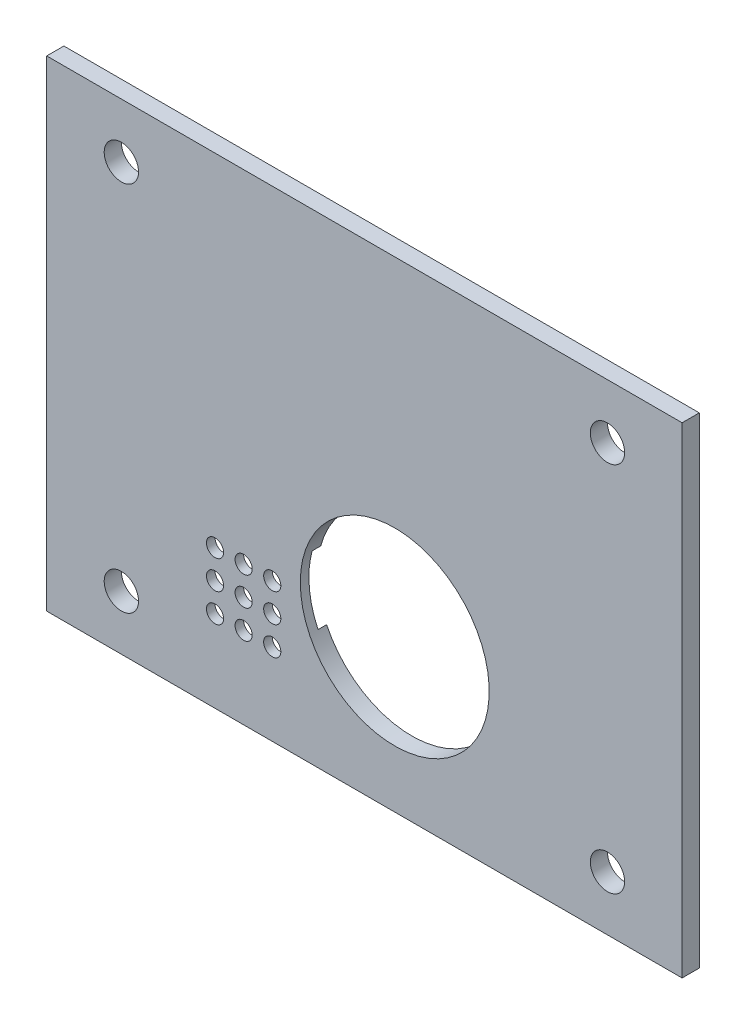
ISO-10303-21;
HEADER;
FILE_DESCRIPTION(('STEP AP214'),'2;1');
FILE_NAME('part.step','',(''),(''),'','','');
FILE_SCHEMA(('AUTOMOTIVE_DESIGN { 1 0 10303 214 1 1 1 1 }'));
ENDSEC;
DATA;
#1=APPLICATION_CONTEXT('core data for automotive mechanical design processes');
#2=APPLICATION_PROTOCOL_DEFINITION('international standard','automotive_design',2000,#1);
#3=PRODUCT_CONTEXT('',#1,'mechanical');
#4=PRODUCT('Part','Part','',(#3));
#5=PRODUCT_RELATED_PRODUCT_CATEGORY('part','',(#4));
#6=PRODUCT_DEFINITION_FORMATION('','',#4);
#7=PRODUCT_DEFINITION_CONTEXT('part definition',#1,'design');
#8=PRODUCT_DEFINITION('design','',#6,#7);
#9=PRODUCT_DEFINITION_SHAPE('','',#8);
#10=(LENGTH_UNIT() NAMED_UNIT(*) SI_UNIT(.MILLI.,.METRE.));
#11=(NAMED_UNIT(*) PLANE_ANGLE_UNIT() SI_UNIT($,.RADIAN.));
#12=(NAMED_UNIT(*) SI_UNIT($,.STERADIAN.) SOLID_ANGLE_UNIT());
#13=UNCERTAINTY_MEASURE_WITH_UNIT(LENGTH_MEASURE(1.E-05),#10,'distance_accuracy_value','');
#14=(GEOMETRIC_REPRESENTATION_CONTEXT(3) GLOBAL_UNCERTAINTY_ASSIGNED_CONTEXT((#13)) GLOBAL_UNIT_ASSIGNED_CONTEXT((#10,
#11,#12)) REPRESENTATION_CONTEXT('',''));
#15=CARTESIAN_POINT('',(0.,0.,0.));
#16=DIRECTION('',(0.,0.,1.));
#17=DIRECTION('',(1.,0.,0.));
#18=AXIS2_PLACEMENT_3D('',#15,#16,#17);
#19=CARTESIAN_POINT('',(0.,0.,0.));
#20=DIRECTION('',(0.,0.,-1.));
#21=DIRECTION('',(-1.,0.,0.));
#22=AXIS2_PLACEMENT_3D('',#19,#20,#21);
#23=PLANE('',#22);
#24=CARTESIAN_POINT('',(95.96,7.54,0.));
#25=DIRECTION('',(0.,0.,1.));
#26=DIRECTION('',(1.,0.,0.));
#27=AXIS2_PLACEMENT_3D('',#24,#25,#26);
#28=CIRCLE('',#27,3.00000000000001);
#29=CARTESIAN_POINT('',(98.96,7.54,0.));
#30=VERTEX_POINT('',#29);
#31=EDGE_CURVE('E158',#30,#30,#28,.T.);
#32=ORIENTED_EDGE('',*,*,#31,.T.);
#33=EDGE_LOOP('',(#32));
#34=FACE_BOUND('',#33,.T.);
#35=CARTESIAN_POINT('',(11.04,72.46,0.));
#36=DIRECTION('',(0.,0.,1.));
#37=DIRECTION('',(1.,0.,0.));
#38=AXIS2_PLACEMENT_3D('',#35,#36,#37);
#39=CIRCLE('',#38,3.);
#40=CARTESIAN_POINT('',(14.04,72.46,0.));
#41=VERTEX_POINT('',#40);
#42=EDGE_CURVE('E157',#41,#41,#39,.T.);
#43=ORIENTED_EDGE('',*,*,#42,.T.);
#44=EDGE_LOOP('',(#43));
#45=FACE_BOUND('',#44,.T.);
#46=CARTESIAN_POINT('',(95.96,72.46,0.));
#47=DIRECTION('',(0.,0.,1.));
#48=DIRECTION('',(1.,0.,0.));
#49=AXIS2_PLACEMENT_3D('',#46,#47,#48);
#50=CIRCLE('',#49,3.00000000000001);
#51=CARTESIAN_POINT('',(98.96,72.46,0.));
#52=VERTEX_POINT('',#51);
#53=EDGE_CURVE('E154',#52,#52,#50,.T.);
#54=ORIENTED_EDGE('',*,*,#53,.T.);
#55=EDGE_LOOP('',(#54));
#56=FACE_BOUND('',#55,.T.);
#57=CARTESIAN_POINT('',(11.04,7.54,0.));
#58=DIRECTION('',(0.,0.,1.));
#59=DIRECTION('',(1.,0.,0.));
#60=AXIS2_PLACEMENT_3D('',#57,#58,#59);
#61=CIRCLE('',#60,3.);
#62=CARTESIAN_POINT('',(14.04,7.54,0.));
#63=VERTEX_POINT('',#62);
#64=EDGE_CURVE('E161',#63,#63,#61,.T.);
#65=ORIENTED_EDGE('',*,*,#64,.T.);
#66=EDGE_LOOP('',(#65));
#67=FACE_BOUND('',#66,.T.);
#68=DIRECTION('',(0.,-1.,0.));
#69=VECTOR('',#68,1.);
#70=CARTESIAN_POINT('',(-2.,-2.,0.));
#71=LINE('',#70,#69);
#72=CARTESIAN_POINT('',(-2.,82.,0.));
#73=VERTEX_POINT('',#72);
#74=CARTESIAN_POINT('',(-2.,-2.,0.));
#75=VERTEX_POINT('',#74);
#76=EDGE_CURVE('E178',#73,#75,#71,.T.);
#77=ORIENTED_EDGE('',*,*,#76,.F.);
#78=DIRECTION('',(-1.,0.,0.));
#79=VECTOR('',#78,1.);
#80=CARTESIAN_POINT('',(-2.,82.,0.));
#81=LINE('',#80,#79);
#82=CARTESIAN_POINT('',(109.,82.,0.));
#83=VERTEX_POINT('',#82);
#84=EDGE_CURVE('E86',#83,#73,#81,.T.);
#85=ORIENTED_EDGE('',*,*,#84,.F.);
#86=DIRECTION('',(0.,1.,0.));
#87=VECTOR('',#86,1.);
#88=CARTESIAN_POINT('',(109.,-2.,0.));
#89=LINE('',#88,#87);
#90=CARTESIAN_POINT('',(109.,-2.,0.));
#91=VERTEX_POINT('',#90);
#92=EDGE_CURVE('E190',#91,#83,#89,.T.);
#93=ORIENTED_EDGE('',*,*,#92,.F.);
#94=DIRECTION('',(1.,0.,0.));
#95=VECTOR('',#94,1.);
#96=CARTESIAN_POINT('',(-2.,-2.,0.));
#97=LINE('',#96,#95);
#98=EDGE_CURVE('E188',#75,#91,#97,.T.);
#99=ORIENTED_EDGE('',*,*,#98,.F.);
#100=EDGE_LOOP('',(#77,#85,#93,#99));
#101=FACE_BOUND('',#100,.T.);
#102=DIRECTION('',(1.,0.,0.));
#103=VECTOR('',#102,1.);
#104=CARTESIAN_POINT('',(20.9,5.8,0.));
#105=LINE('',#104,#103);
#106=CARTESIAN_POINT('',(20.9,5.8,0.));
#107=VERTEX_POINT('',#106);
#108=CARTESIAN_POINT('',(43.9,5.8,0.));
#109=VERTEX_POINT('',#108);
#110=EDGE_CURVE('E142',#107,#109,#105,.T.);
#111=ORIENTED_EDGE('',*,*,#110,.T.);
#112=DIRECTION('',(0.,1.,0.));
#113=VECTOR('',#112,1.);
#114=CARTESIAN_POINT('',(43.9,5.8,0.));
#115=LINE('',#114,#113);
#116=CARTESIAN_POINT('',(43.9,17.4119819413322,0.));
#117=VERTEX_POINT('',#116);
#118=EDGE_CURVE('E255',#109,#117,#115,.T.);
#119=ORIENTED_EDGE('',*,*,#118,.T.);
#120=CARTESIAN_POINT('',(58.8,24.5,0.));
#121=DIRECTION('',(0.,0.,1.));
#122=DIRECTION('',(1.,0.,0.));
#123=AXIS2_PLACEMENT_3D('',#120,#121,#122);
#124=CIRCLE('',#123,16.5);
#125=CARTESIAN_POINT('',(42.8701537986081,28.8,0.));
#126=VERTEX_POINT('',#125);
#127=EDGE_CURVE('E143',#117,#126,#124,.T.);
#128=ORIENTED_EDGE('',*,*,#127,.T.);
#129=DIRECTION('',(-1.,0.,0.));
#130=VECTOR('',#129,1.);
#131=CARTESIAN_POINT('',(20.9,28.8,0.));
#132=LINE('',#131,#130);
#133=CARTESIAN_POINT('',(20.9,28.8,0.));
#134=VERTEX_POINT('',#133);
#135=EDGE_CURVE('E138',#126,#134,#132,.T.);
#136=ORIENTED_EDGE('',*,*,#135,.T.);
#137=DIRECTION('',(0.,-1.,0.));
#138=VECTOR('',#137,1.);
#139=CARTESIAN_POINT('',(20.9,5.8,0.));
#140=LINE('',#139,#138);
#141=EDGE_CURVE('E249',#134,#107,#140,.T.);
#142=ORIENTED_EDGE('',*,*,#141,.T.);
#143=EDGE_LOOP('',(#111,#119,#128,#136,#142));
#144=FACE_BOUND('',#143,.T.);
#145=ADVANCED_FACE('F39',(#34,#45,#56,#67,#101,#144),#23,.T.);
#146=CARTESIAN_POINT('',(58.8,24.5,6.));
#147=DIRECTION('',(0.,0.,-1.));
#148=DIRECTION('',(-1.,0.,0.));
#149=AXIS2_PLACEMENT_3D('',#146,#147,#148);
#150=CYLINDRICAL_SURFACE('',#149,16.5);
#151=CARTESIAN_POINT('',(58.8,24.5,3.));
#152=DIRECTION('',(0.,0.,-1.));
#153=DIRECTION('',(-1.,0.,0.));
#154=AXIS2_PLACEMENT_3D('',#151,#152,#153);
#155=CIRCLE('',#154,16.5);
#156=CARTESIAN_POINT('',(42.3,24.5,3.));
#157=VERTEX_POINT('',#156);
#158=EDGE_CURVE('E147',#157,#157,#155,.F.);
#159=ORIENTED_EDGE('',*,*,#158,.T.);
#160=EDGE_LOOP('',(#159));
#161=FACE_BOUND('',#160,.T.);
#162=ORIENTED_EDGE('',*,*,#127,.F.);
#163=DIRECTION('',(0.,0.,-1.));
#164=VECTOR('',#163,1.);
#165=CARTESIAN_POINT('',(43.9,17.4119819413322,6.));
#166=LINE('',#165,#164);
#167=CARTESIAN_POINT('',(43.9,17.4119819413322,1.5));
#168=VERTEX_POINT('',#167);
#169=EDGE_CURVE('E11',#117,#168,#166,.F.);
#170=ORIENTED_EDGE('',*,*,#169,.T.);
#171=CARTESIAN_POINT('',(58.8,24.5,1.5));
#172=DIRECTION('',(0.,0.,-1.));
#173=DIRECTION('',(-1.,0.,0.));
#174=AXIS2_PLACEMENT_3D('',#171,#172,#173);
#175=CIRCLE('',#174,16.5);
#176=CARTESIAN_POINT('',(42.8701537986081,28.8,1.5));
#177=VERTEX_POINT('',#176);
#178=EDGE_CURVE('E201',#168,#177,#175,.T.);
#179=ORIENTED_EDGE('',*,*,#178,.T.);
#180=DIRECTION('',(0.,0.,-1.));
#181=VECTOR('',#180,1.);
#182=CARTESIAN_POINT('',(42.8701537986081,28.8,6.));
#183=LINE('',#182,#181);
#184=EDGE_CURVE('E48',#177,#126,#183,.T.);
#185=ORIENTED_EDGE('',*,*,#184,.T.);
#186=EDGE_LOOP('',(#162,#170,#179,#185));
#187=FACE_BOUND('',#186,.T.);
#188=ADVANCED_FACE('F265',(#161,#187),#150,.F.);
#189=CARTESIAN_POINT('',(-2.,-2.,3.));
#190=DIRECTION('',(1.,0.,0.));
#191=DIRECTION('',(0.,0.,-1.));
#192=AXIS2_PLACEMENT_3D('',#189,#190,#191);
#193=PLANE('',#192);
#194=ORIENTED_EDGE('',*,*,#76,.T.);
#195=DIRECTION('',(0.,0.,-1.));
#196=VECTOR('',#195,1.);
#197=CARTESIAN_POINT('',(-2.,-2.,3.));
#198=LINE('',#197,#196);
#199=CARTESIAN_POINT('',(-2.,-2.,3.));
#200=VERTEX_POINT('',#199);
#201=EDGE_CURVE('E199',#200,#75,#198,.T.);
#202=ORIENTED_EDGE('',*,*,#201,.F.);
#203=DIRECTION('',(0.,-1.,0.));
#204=VECTOR('',#203,1.);
#205=CARTESIAN_POINT('',(-2.,-2.,3.));
#206=LINE('',#205,#204);
#207=CARTESIAN_POINT('',(-2.,82.,3.));
#208=VERTEX_POINT('',#207);
#209=EDGE_CURVE('E179',#208,#200,#206,.T.);
#210=ORIENTED_EDGE('',*,*,#209,.F.);
#211=DIRECTION('',(0.,0.,-1.));
#212=VECTOR('',#211,1.);
#213=CARTESIAN_POINT('',(-2.,82.,3.));
#214=LINE('',#213,#212);
#215=EDGE_CURVE('E185',#208,#73,#214,.T.);
#216=ORIENTED_EDGE('',*,*,#215,.T.);
#217=EDGE_LOOP('',(#194,#202,#210,#216));
#218=FACE_BOUND('',#217,.T.);
#219=ADVANCED_FACE('F41',(#218),#193,.F.);
#220=CARTESIAN_POINT('',(-2.,-2.,3.));
#221=DIRECTION('',(0.,1.,0.));
#222=DIRECTION('',(0.,0.,1.));
#223=AXIS2_PLACEMENT_3D('',#220,#221,#222);
#224=PLANE('',#223);
#225=ORIENTED_EDGE('',*,*,#98,.T.);
#226=DIRECTION('',(0.,0.,-1.));
#227=VECTOR('',#226,1.);
#228=CARTESIAN_POINT('',(109.,-2.,3.));
#229=LINE('',#228,#227);
#230=CARTESIAN_POINT('',(109.,-2.,3.));
#231=VERTEX_POINT('',#230);
#232=EDGE_CURVE('E196',#231,#91,#229,.T.);
#233=ORIENTED_EDGE('',*,*,#232,.F.);
#234=DIRECTION('',(1.,0.,0.));
#235=VECTOR('',#234,1.);
#236=CARTESIAN_POINT('',(-2.,-2.,3.));
#237=LINE('',#236,#235);
#238=EDGE_CURVE('E94',#200,#231,#237,.T.);
#239=ORIENTED_EDGE('',*,*,#238,.F.);
#240=ORIENTED_EDGE('',*,*,#201,.T.);
#241=EDGE_LOOP('',(#225,#233,#239,#240));
#242=FACE_BOUND('',#241,.T.);
#243=ADVANCED_FACE('F295',(#242),#224,.F.);
#244=CARTESIAN_POINT('',(109.,-2.,3.));
#245=DIRECTION('',(-1.,0.,0.));
#246=DIRECTION('',(0.,0.,1.));
#247=AXIS2_PLACEMENT_3D('',#244,#245,#246);
#248=PLANE('',#247);
#249=ORIENTED_EDGE('',*,*,#92,.T.);
#250=DIRECTION('',(0.,0.,-1.));
#251=VECTOR('',#250,1.);
#252=CARTESIAN_POINT('',(109.,82.,3.));
#253=LINE('',#252,#251);
#254=CARTESIAN_POINT('',(109.,82.,3.));
#255=VERTEX_POINT('',#254);
#256=EDGE_CURVE('E194',#255,#83,#253,.T.);
#257=ORIENTED_EDGE('',*,*,#256,.F.);
#258=DIRECTION('',(0.,1.,0.));
#259=VECTOR('',#258,1.);
#260=CARTESIAN_POINT('',(109.,-2.,3.));
#261=LINE('',#260,#259);
#262=EDGE_CURVE('E182',#231,#255,#261,.T.);
#263=ORIENTED_EDGE('',*,*,#262,.F.);
#264=ORIENTED_EDGE('',*,*,#232,.T.);
#265=EDGE_LOOP('',(#249,#257,#263,#264));
#266=FACE_BOUND('',#265,.T.);
#267=ADVANCED_FACE('F293',(#266),#248,.F.);
#268=CARTESIAN_POINT('',(-2.,82.,3.));
#269=DIRECTION('',(0.,-1.,0.));
#270=DIRECTION('',(0.,0.,-1.));
#271=AXIS2_PLACEMENT_3D('',#268,#269,#270);
#272=PLANE('',#271);
#273=ORIENTED_EDGE('',*,*,#84,.T.);
#274=ORIENTED_EDGE('',*,*,#215,.F.);
#275=DIRECTION('',(-1.,0.,0.));
#276=VECTOR('',#275,1.);
#277=CARTESIAN_POINT('',(-2.,82.,3.));
#278=LINE('',#277,#276);
#279=EDGE_CURVE('E65',#255,#208,#278,.T.);
#280=ORIENTED_EDGE('',*,*,#279,.F.);
#281=ORIENTED_EDGE('',*,*,#256,.T.);
#282=EDGE_LOOP('',(#273,#274,#280,#281));
#283=FACE_BOUND('',#282,.T.);
#284=ADVANCED_FACE('F290',(#283),#272,.F.);
#285=CARTESIAN_POINT('',(0.,0.,3.));
#286=DIRECTION('',(0.,0.,-1.));
#287=DIRECTION('',(-1.,0.,0.));
#288=AXIS2_PLACEMENT_3D('',#285,#286,#287);
#289=PLANE('',#288);
#290=CARTESIAN_POINT('',(27.4,17.3,3.));
#291=DIRECTION('',(0.,0.,-1.));
#292=DIRECTION('',(-1.,0.,0.));
#293=AXIS2_PLACEMENT_3D('',#290,#291,#292);
#294=CIRCLE('',#293,1.5);
#295=CARTESIAN_POINT('',(25.9,17.3,3.));
#296=VERTEX_POINT('',#295);
#297=EDGE_CURVE('E247',#296,#296,#294,.F.);
#298=ORIENTED_EDGE('',*,*,#297,.F.);
#299=EDGE_LOOP('',(#298));
#300=FACE_BOUND('',#299,.T.);
#301=CARTESIAN_POINT('',(27.4,22.3,3.));
#302=DIRECTION('',(0.,0.,-1.));
#303=DIRECTION('',(-1.,0.,0.));
#304=AXIS2_PLACEMENT_3D('',#301,#302,#303);
#305=CIRCLE('',#304,1.5);
#306=CARTESIAN_POINT('',(25.9,22.3,3.));
#307=VERTEX_POINT('',#306);
#308=EDGE_CURVE('E235',#307,#307,#305,.F.);
#309=ORIENTED_EDGE('',*,*,#308,.F.);
#310=EDGE_LOOP('',(#309));
#311=FACE_BOUND('',#310,.T.);
#312=CARTESIAN_POINT('',(32.4,12.3,3.));
#313=DIRECTION('',(0.,0.,-1.));
#314=DIRECTION('',(-1.,0.,0.));
#315=AXIS2_PLACEMENT_3D('',#312,#313,#314);
#316=CIRCLE('',#315,1.5);
#317=CARTESIAN_POINT('',(30.9,12.3,3.));
#318=VERTEX_POINT('',#317);
#319=EDGE_CURVE('E232',#318,#318,#316,.F.);
#320=ORIENTED_EDGE('',*,*,#319,.F.);
#321=EDGE_LOOP('',(#320));
#322=FACE_BOUND('',#321,.T.);
#323=CARTESIAN_POINT('',(32.4,17.3,3.));
#324=DIRECTION('',(0.,0.,-1.));
#325=DIRECTION('',(-1.,0.,0.));
#326=AXIS2_PLACEMENT_3D('',#323,#324,#325);
#327=CIRCLE('',#326,1.5);
#328=CARTESIAN_POINT('',(30.9,17.3,3.));
#329=VERTEX_POINT('',#328);
#330=EDGE_CURVE('E229',#329,#329,#327,.F.);
#331=ORIENTED_EDGE('',*,*,#330,.F.);
#332=EDGE_LOOP('',(#331));
#333=FACE_BOUND('',#332,.T.);
#334=CARTESIAN_POINT('',(37.4,22.3,3.));
#335=DIRECTION('',(0.,0.,-1.));
#336=DIRECTION('',(-1.,0.,0.));
#337=AXIS2_PLACEMENT_3D('',#334,#335,#336);
#338=CIRCLE('',#337,1.5);
#339=CARTESIAN_POINT('',(35.9,22.3,3.));
#340=VERTEX_POINT('',#339);
#341=EDGE_CURVE('E225',#340,#340,#338,.F.);
#342=ORIENTED_EDGE('',*,*,#341,.F.);
#343=EDGE_LOOP('',(#342));
#344=FACE_BOUND('',#343,.T.);
#345=CARTESIAN_POINT('',(37.4,17.3,3.));
#346=DIRECTION('',(0.,0.,-1.));
#347=DIRECTION('',(-1.,0.,0.));
#348=AXIS2_PLACEMENT_3D('',#345,#346,#347);
#349=CIRCLE('',#348,1.5);
#350=CARTESIAN_POINT('',(35.9,17.3,3.));
#351=VERTEX_POINT('',#350);
#352=EDGE_CURVE('E221',#351,#351,#349,.F.);
#353=ORIENTED_EDGE('',*,*,#352,.F.);
#354=EDGE_LOOP('',(#353));
#355=FACE_BOUND('',#354,.T.);
#356=CARTESIAN_POINT('',(37.4,12.3,3.));
#357=DIRECTION('',(0.,0.,-1.));
#358=DIRECTION('',(-1.,0.,0.));
#359=AXIS2_PLACEMENT_3D('',#356,#357,#358);
#360=CIRCLE('',#359,1.5);
#361=CARTESIAN_POINT('',(35.9,12.3,3.));
#362=VERTEX_POINT('',#361);
#363=EDGE_CURVE('E217',#362,#362,#360,.F.);
#364=ORIENTED_EDGE('',*,*,#363,.F.);
#365=EDGE_LOOP('',(#364));
#366=FACE_BOUND('',#365,.T.);
#367=CARTESIAN_POINT('',(32.4,22.3,3.));
#368=DIRECTION('',(0.,0.,-1.));
#369=DIRECTION('',(-1.,0.,0.));
#370=AXIS2_PLACEMENT_3D('',#367,#368,#369);
#371=CIRCLE('',#370,1.5);
#372=CARTESIAN_POINT('',(30.9,22.3,3.));
#373=VERTEX_POINT('',#372);
#374=EDGE_CURVE('E213',#373,#373,#371,.F.);
#375=ORIENTED_EDGE('',*,*,#374,.F.);
#376=EDGE_LOOP('',(#375));
#377=FACE_BOUND('',#376,.T.);
#378=CARTESIAN_POINT('',(27.4,12.3,3.));
#379=DIRECTION('',(0.,0.,-1.));
#380=DIRECTION('',(-1.,0.,0.));
#381=AXIS2_PLACEMENT_3D('',#378,#379,#380);
#382=CIRCLE('',#381,1.5);
#383=CARTESIAN_POINT('',(25.9,12.3,3.));
#384=VERTEX_POINT('',#383);
#385=EDGE_CURVE('E209',#384,#384,#382,.F.);
#386=ORIENTED_EDGE('',*,*,#385,.F.);
#387=EDGE_LOOP('',(#386));
#388=FACE_BOUND('',#387,.T.);
#389=ORIENTED_EDGE('',*,*,#158,.F.);
#390=EDGE_LOOP('',(#389));
#391=FACE_BOUND('',#390,.T.);
#392=CARTESIAN_POINT('',(95.96,7.54,3.));
#393=DIRECTION('',(0.,0.,-1.));
#394=DIRECTION('',(-1.,0.,0.));
#395=AXIS2_PLACEMENT_3D('',#392,#393,#394);
#396=CIRCLE('',#395,3.00000000000001);
#397=CARTESIAN_POINT('',(92.96,7.54,3.));
#398=VERTEX_POINT('',#397);
#399=EDGE_CURVE('E175',#398,#398,#396,.F.);
#400=ORIENTED_EDGE('',*,*,#399,.F.);
#401=EDGE_LOOP('',(#400));
#402=FACE_BOUND('',#401,.T.);
#403=CARTESIAN_POINT('',(11.04,72.46,3.));
#404=DIRECTION('',(0.,0.,-1.));
#405=DIRECTION('',(-1.,0.,0.));
#406=AXIS2_PLACEMENT_3D('',#403,#404,#405);
#407=CIRCLE('',#406,3.);
#408=CARTESIAN_POINT('',(8.04,72.46,3.));
#409=VERTEX_POINT('',#408);
#410=EDGE_CURVE('E172',#409,#409,#407,.F.);
#411=ORIENTED_EDGE('',*,*,#410,.F.);
#412=EDGE_LOOP('',(#411));
#413=FACE_BOUND('',#412,.T.);
#414=CARTESIAN_POINT('',(95.96,72.46,3.));
#415=DIRECTION('',(0.,0.,-1.));
#416=DIRECTION('',(-1.,0.,0.));
#417=AXIS2_PLACEMENT_3D('',#414,#415,#416);
#418=CIRCLE('',#417,3.00000000000001);
#419=CARTESIAN_POINT('',(92.96,72.46,3.));
#420=VERTEX_POINT('',#419);
#421=EDGE_CURVE('E169',#420,#420,#418,.F.);
#422=ORIENTED_EDGE('',*,*,#421,.F.);
#423=EDGE_LOOP('',(#422));
#424=FACE_BOUND('',#423,.T.);
#425=CARTESIAN_POINT('',(11.04,7.54,3.));
#426=DIRECTION('',(0.,0.,-1.));
#427=DIRECTION('',(-1.,0.,0.));
#428=AXIS2_PLACEMENT_3D('',#425,#426,#427);
#429=CIRCLE('',#428,3.);
#430=CARTESIAN_POINT('',(8.04,7.54,3.));
#431=VERTEX_POINT('',#430);
#432=EDGE_CURVE('E166',#431,#431,#429,.F.);
#433=ORIENTED_EDGE('',*,*,#432,.F.);
#434=EDGE_LOOP('',(#433));
#435=FACE_BOUND('',#434,.T.);
#436=ORIENTED_EDGE('',*,*,#209,.T.);
#437=ORIENTED_EDGE('',*,*,#238,.T.);
#438=ORIENTED_EDGE('',*,*,#262,.T.);
#439=ORIENTED_EDGE('',*,*,#279,.T.);
#440=EDGE_LOOP('',(#436,#437,#438,#439));
#441=FACE_BOUND('',#440,.T.);
#442=ADVANCED_FACE('F288',(#300,#311,#322,#333,#344,#355,#366,#377,#388,#391,#402,#413,#424,
#435,#441),#289,.F.);
#443=CARTESIAN_POINT('',(11.04,7.54,6.));
#444=DIRECTION('',(0.,0.,-1.));
#445=DIRECTION('',(-1.,0.,0.));
#446=AXIS2_PLACEMENT_3D('',#443,#444,#445);
#447=CYLINDRICAL_SURFACE('',#446,3.);
#448=ORIENTED_EDGE('',*,*,#64,.F.);
#449=EDGE_LOOP('',(#448));
#450=FACE_BOUND('',#449,.T.);
#451=ORIENTED_EDGE('',*,*,#432,.T.);
#452=EDGE_LOOP('',(#451));
#453=FACE_BOUND('',#452,.T.);
#454=ADVANCED_FACE('F310',(#450,#453),#447,.F.);
#455=CARTESIAN_POINT('',(95.96,72.46,6.));
#456=DIRECTION('',(0.,0.,-1.));
#457=DIRECTION('',(-1.,0.,0.));
#458=AXIS2_PLACEMENT_3D('',#455,#456,#457);
#459=CYLINDRICAL_SURFACE('',#458,3.00000000000001);
#460=ORIENTED_EDGE('',*,*,#53,.F.);
#461=EDGE_LOOP('',(#460));
#462=FACE_BOUND('',#461,.T.);
#463=ORIENTED_EDGE('',*,*,#421,.T.);
#464=EDGE_LOOP('',(#463));
#465=FACE_BOUND('',#464,.T.);
#466=ADVANCED_FACE('F316',(#462,#465),#459,.F.);
#467=CARTESIAN_POINT('',(11.04,72.46,6.));
#468=DIRECTION('',(0.,0.,-1.));
#469=DIRECTION('',(-1.,0.,0.));
#470=AXIS2_PLACEMENT_3D('',#467,#468,#469);
#471=CYLINDRICAL_SURFACE('',#470,3.);
#472=ORIENTED_EDGE('',*,*,#42,.F.);
#473=EDGE_LOOP('',(#472));
#474=FACE_BOUND('',#473,.T.);
#475=ORIENTED_EDGE('',*,*,#410,.T.);
#476=EDGE_LOOP('',(#475));
#477=FACE_BOUND('',#476,.T.);
#478=ADVANCED_FACE('F353',(#474,#477),#471,.F.);
#479=CARTESIAN_POINT('',(95.96,7.54,6.));
#480=DIRECTION('',(0.,0.,-1.));
#481=DIRECTION('',(-1.,0.,0.));
#482=AXIS2_PLACEMENT_3D('',#479,#480,#481);
#483=CYLINDRICAL_SURFACE('',#482,3.00000000000001);
#484=ORIENTED_EDGE('',*,*,#31,.F.);
#485=EDGE_LOOP('',(#484));
#486=FACE_BOUND('',#485,.T.);
#487=ORIENTED_EDGE('',*,*,#399,.T.);
#488=EDGE_LOOP('',(#487));
#489=FACE_BOUND('',#488,.T.);
#490=ADVANCED_FACE('F359',(#486,#489),#483,.F.);
#491=CARTESIAN_POINT('',(20.9,5.8,1.5));
#492=DIRECTION('',(1.,0.,0.));
#493=DIRECTION('',(0.,0.,-1.));
#494=AXIS2_PLACEMENT_3D('',#491,#492,#493);
#495=PLANE('',#494);
#496=ORIENTED_EDGE('',*,*,#141,.F.);
#497=DIRECTION('',(0.,0.,-1.));
#498=VECTOR('',#497,1.);
#499=CARTESIAN_POINT('',(20.9,28.8,1.5));
#500=LINE('',#499,#498);
#501=CARTESIAN_POINT('',(20.9,28.8,1.5));
#502=VERTEX_POINT('',#501);
#503=EDGE_CURVE('E137',#502,#134,#500,.T.);
#504=ORIENTED_EDGE('',*,*,#503,.F.);
#505=DIRECTION('',(0.,-1.,0.));
#506=VECTOR('',#505,1.);
#507=CARTESIAN_POINT('',(20.9,5.8,1.5));
#508=LINE('',#507,#506);
#509=CARTESIAN_POINT('',(20.9,5.8,1.5));
#510=VERTEX_POINT('',#509);
#511=EDGE_CURVE('E123',#502,#510,#508,.T.);
#512=ORIENTED_EDGE('',*,*,#511,.T.);
#513=DIRECTION('',(0.,0.,-1.));
#514=VECTOR('',#513,1.);
#515=CARTESIAN_POINT('',(20.9,5.8,1.5));
#516=LINE('',#515,#514);
#517=EDGE_CURVE('E135',#510,#107,#516,.T.);
#518=ORIENTED_EDGE('',*,*,#517,.T.);
#519=EDGE_LOOP('',(#496,#504,#512,#518));
#520=FACE_BOUND('',#519,.T.);
#521=ADVANCED_FACE('F134',(#520),#495,.T.);
#522=CARTESIAN_POINT('',(20.9,5.8,1.5));
#523=DIRECTION('',(0.,1.,0.));
#524=DIRECTION('',(0.,0.,1.));
#525=AXIS2_PLACEMENT_3D('',#522,#523,#524);
#526=PLANE('',#525);
#527=ORIENTED_EDGE('',*,*,#110,.F.);
#528=ORIENTED_EDGE('',*,*,#517,.F.);
#529=DIRECTION('',(1.,0.,0.));
#530=VECTOR('',#529,1.);
#531=CARTESIAN_POINT('',(20.9,5.8,1.5));
#532=LINE('',#531,#530);
#533=CARTESIAN_POINT('',(43.9,5.8,1.5));
#534=VERTEX_POINT('',#533);
#535=EDGE_CURVE('E120',#510,#534,#532,.T.);
#536=ORIENTED_EDGE('',*,*,#535,.T.);
#537=DIRECTION('',(0.,0.,-1.));
#538=VECTOR('',#537,1.);
#539=CARTESIAN_POINT('',(43.9,5.8,1.5));
#540=LINE('',#539,#538);
#541=EDGE_CURVE('E144',#534,#109,#540,.T.);
#542=ORIENTED_EDGE('',*,*,#541,.T.);
#543=EDGE_LOOP('',(#527,#528,#536,#542));
#544=FACE_BOUND('',#543,.T.);
#545=ADVANCED_FACE('F140',(#544),#526,.T.);
#546=CARTESIAN_POINT('',(43.9,5.8,1.5));
#547=DIRECTION('',(-1.,0.,0.));
#548=DIRECTION('',(0.,0.,1.));
#549=AXIS2_PLACEMENT_3D('',#546,#547,#548);
#550=PLANE('',#549);
#551=ORIENTED_EDGE('',*,*,#118,.F.);
#552=ORIENTED_EDGE('',*,*,#541,.F.);
#553=DIRECTION('',(0.,1.,0.));
#554=VECTOR('',#553,1.);
#555=CARTESIAN_POINT('',(43.9,5.8,1.5));
#556=LINE('',#555,#554);
#557=EDGE_CURVE('E125',#534,#168,#556,.T.);
#558=ORIENTED_EDGE('',*,*,#557,.T.);
#559=ORIENTED_EDGE('',*,*,#169,.F.);
#560=EDGE_LOOP('',(#551,#552,#558,#559));
#561=FACE_BOUND('',#560,.T.);
#562=ADVANCED_FACE('F267',(#561),#550,.T.);
#563=CARTESIAN_POINT('',(20.9,28.8,1.5));
#564=DIRECTION('',(0.,-1.,0.));
#565=DIRECTION('',(0.,0.,-1.));
#566=AXIS2_PLACEMENT_3D('',#563,#564,#565);
#567=PLANE('',#566);
#568=DIRECTION('',(-1.,0.,0.));
#569=VECTOR('',#568,1.);
#570=CARTESIAN_POINT('',(20.9,28.8,1.5));
#571=LINE('',#570,#569);
#572=EDGE_CURVE('E56',#177,#502,#571,.T.);
#573=ORIENTED_EDGE('',*,*,#572,.T.);
#574=ORIENTED_EDGE('',*,*,#503,.T.);
#575=ORIENTED_EDGE('',*,*,#135,.F.);
#576=ORIENTED_EDGE('',*,*,#184,.F.);
#577=EDGE_LOOP('',(#573,#574,#575,#576));
#578=FACE_BOUND('',#577,.T.);
#579=ADVANCED_FACE('F260',(#578),#567,.T.);
#580=CARTESIAN_POINT('',(0.,0.,1.5));
#581=DIRECTION('',(0.,0.,-1.));
#582=DIRECTION('',(-1.,0.,0.));
#583=AXIS2_PLACEMENT_3D('',#580,#581,#582);
#584=PLANE('',#583);
#585=CARTESIAN_POINT('',(27.4,17.3,1.5));
#586=DIRECTION('',(0.,0.,-1.));
#587=DIRECTION('',(-1.,0.,0.));
#588=AXIS2_PLACEMENT_3D('',#585,#586,#587);
#589=CIRCLE('',#588,1.5);
#590=CARTESIAN_POINT('',(25.9,17.3,1.5));
#591=VERTEX_POINT('',#590);
#592=EDGE_CURVE('E43',#591,#591,#589,.F.);
#593=ORIENTED_EDGE('',*,*,#592,.T.);
#594=EDGE_LOOP('',(#593));
#595=FACE_BOUND('',#594,.T.);
#596=CARTESIAN_POINT('',(27.4,22.3,1.5));
#597=DIRECTION('',(0.,0.,-1.));
#598=DIRECTION('',(-1.,0.,0.));
#599=AXIS2_PLACEMENT_3D('',#596,#597,#598);
#600=CIRCLE('',#599,1.5);
#601=CARTESIAN_POINT('',(25.9,22.3,1.5));
#602=VERTEX_POINT('',#601);
#603=EDGE_CURVE('E233',#602,#602,#600,.F.);
#604=ORIENTED_EDGE('',*,*,#603,.T.);
#605=EDGE_LOOP('',(#604));
#606=FACE_BOUND('',#605,.T.);
#607=CARTESIAN_POINT('',(32.4,12.3,1.5));
#608=DIRECTION('',(0.,0.,-1.));
#609=DIRECTION('',(-1.,0.,0.));
#610=AXIS2_PLACEMENT_3D('',#607,#608,#609);
#611=CIRCLE('',#610,1.5);
#612=CARTESIAN_POINT('',(30.9,12.3,1.5));
#613=VERTEX_POINT('',#612);
#614=EDGE_CURVE('E230',#613,#613,#611,.F.);
#615=ORIENTED_EDGE('',*,*,#614,.T.);
#616=EDGE_LOOP('',(#615));
#617=FACE_BOUND('',#616,.T.);
#618=CARTESIAN_POINT('',(32.4,17.3,1.5));
#619=DIRECTION('',(0.,0.,-1.));
#620=DIRECTION('',(-1.,0.,0.));
#621=AXIS2_PLACEMENT_3D('',#618,#619,#620);
#622=CIRCLE('',#621,1.5);
#623=CARTESIAN_POINT('',(30.9,17.3,1.5));
#624=VERTEX_POINT('',#623);
#625=EDGE_CURVE('E226',#624,#624,#622,.F.);
#626=ORIENTED_EDGE('',*,*,#625,.T.);
#627=EDGE_LOOP('',(#626));
#628=FACE_BOUND('',#627,.T.);
#629=CARTESIAN_POINT('',(37.4,22.3,1.5));
#630=DIRECTION('',(0.,0.,-1.));
#631=DIRECTION('',(-1.,0.,0.));
#632=AXIS2_PLACEMENT_3D('',#629,#630,#631);
#633=CIRCLE('',#632,1.5);
#634=CARTESIAN_POINT('',(35.9,22.3,1.5));
#635=VERTEX_POINT('',#634);
#636=EDGE_CURVE('E222',#635,#635,#633,.F.);
#637=ORIENTED_EDGE('',*,*,#636,.T.);
#638=EDGE_LOOP('',(#637));
#639=FACE_BOUND('',#638,.T.);
#640=CARTESIAN_POINT('',(37.4,17.3,1.5));
#641=DIRECTION('',(0.,0.,-1.));
#642=DIRECTION('',(-1.,0.,0.));
#643=AXIS2_PLACEMENT_3D('',#640,#641,#642);
#644=CIRCLE('',#643,1.5);
#645=CARTESIAN_POINT('',(35.9,17.3,1.5));
#646=VERTEX_POINT('',#645);
#647=EDGE_CURVE('E218',#646,#646,#644,.F.);
#648=ORIENTED_EDGE('',*,*,#647,.T.);
#649=EDGE_LOOP('',(#648));
#650=FACE_BOUND('',#649,.T.);
#651=CARTESIAN_POINT('',(37.4,12.3,1.5));
#652=DIRECTION('',(0.,0.,-1.));
#653=DIRECTION('',(-1.,0.,0.));
#654=AXIS2_PLACEMENT_3D('',#651,#652,#653);
#655=CIRCLE('',#654,1.5);
#656=CARTESIAN_POINT('',(35.9,12.3,1.5));
#657=VERTEX_POINT('',#656);
#658=EDGE_CURVE('E214',#657,#657,#655,.F.);
#659=ORIENTED_EDGE('',*,*,#658,.T.);
#660=EDGE_LOOP('',(#659));
#661=FACE_BOUND('',#660,.T.);
#662=CARTESIAN_POINT('',(32.4,22.3,1.5));
#663=DIRECTION('',(0.,0.,-1.));
#664=DIRECTION('',(-1.,0.,0.));
#665=AXIS2_PLACEMENT_3D('',#662,#663,#664);
#666=CIRCLE('',#665,1.5);
#667=CARTESIAN_POINT('',(30.9,22.3,1.5));
#668=VERTEX_POINT('',#667);
#669=EDGE_CURVE('E210',#668,#668,#666,.F.);
#670=ORIENTED_EDGE('',*,*,#669,.T.);
#671=EDGE_LOOP('',(#670));
#672=FACE_BOUND('',#671,.T.);
#673=CARTESIAN_POINT('',(27.4,12.3,1.5));
#674=DIRECTION('',(0.,0.,-1.));
#675=DIRECTION('',(-1.,0.,0.));
#676=AXIS2_PLACEMENT_3D('',#673,#674,#675);
#677=CIRCLE('',#676,1.5);
#678=CARTESIAN_POINT('',(25.9,12.3,1.5));
#679=VERTEX_POINT('',#678);
#680=EDGE_CURVE('E206',#679,#679,#677,.F.);
#681=ORIENTED_EDGE('',*,*,#680,.T.);
#682=EDGE_LOOP('',(#681));
#683=FACE_BOUND('',#682,.T.);
#684=ORIENTED_EDGE('',*,*,#557,.F.);
#685=ORIENTED_EDGE('',*,*,#535,.F.);
#686=ORIENTED_EDGE('',*,*,#511,.F.);
#687=ORIENTED_EDGE('',*,*,#572,.F.);
#688=ORIENTED_EDGE('',*,*,#178,.F.);
#689=EDGE_LOOP('',(#684,#685,#686,#687,#688));
#690=FACE_BOUND('',#689,.T.);
#691=ADVANCED_FACE('F122',(#595,#606,#617,#628,#639,#650,#661,#672,#683,#690),#584,.T.);
#692=CARTESIAN_POINT('',(27.4,12.3,6.));
#693=DIRECTION('',(0.,0.,-1.));
#694=DIRECTION('',(-1.,0.,0.));
#695=AXIS2_PLACEMENT_3D('',#692,#693,#694);
#696=CYLINDRICAL_SURFACE('',#695,1.5);
#697=ORIENTED_EDGE('',*,*,#680,.F.);
#698=EDGE_LOOP('',(#697));
#699=FACE_BOUND('',#698,.T.);
#700=ORIENTED_EDGE('',*,*,#385,.T.);
#701=EDGE_LOOP('',(#700));
#702=FACE_BOUND('',#701,.T.);
#703=ADVANCED_FACE('F400',(#699,#702),#696,.F.);
#704=CARTESIAN_POINT('',(32.4,22.3,6.));
#705=DIRECTION('',(0.,0.,-1.));
#706=DIRECTION('',(-1.,0.,0.));
#707=AXIS2_PLACEMENT_3D('',#704,#705,#706);
#708=CYLINDRICAL_SURFACE('',#707,1.5);
#709=ORIENTED_EDGE('',*,*,#669,.F.);
#710=EDGE_LOOP('',(#709));
#711=FACE_BOUND('',#710,.T.);
#712=ORIENTED_EDGE('',*,*,#374,.T.);
#713=EDGE_LOOP('',(#712));
#714=FACE_BOUND('',#713,.T.);
#715=ADVANCED_FACE('F410',(#711,#714),#708,.F.);
#716=CARTESIAN_POINT('',(37.4,12.3,6.));
#717=DIRECTION('',(0.,0.,-1.));
#718=DIRECTION('',(-1.,0.,0.));
#719=AXIS2_PLACEMENT_3D('',#716,#717,#718);
#720=CYLINDRICAL_SURFACE('',#719,1.5);
#721=ORIENTED_EDGE('',*,*,#658,.F.);
#722=EDGE_LOOP('',(#721));
#723=FACE_BOUND('',#722,.T.);
#724=ORIENTED_EDGE('',*,*,#363,.T.);
#725=EDGE_LOOP('',(#724));
#726=FACE_BOUND('',#725,.T.);
#727=ADVANCED_FACE('F420',(#723,#726),#720,.F.);
#728=CARTESIAN_POINT('',(37.4,17.3,6.));
#729=DIRECTION('',(0.,0.,-1.));
#730=DIRECTION('',(-1.,0.,0.));
#731=AXIS2_PLACEMENT_3D('',#728,#729,#730);
#732=CYLINDRICAL_SURFACE('',#731,1.5);
#733=ORIENTED_EDGE('',*,*,#647,.F.);
#734=EDGE_LOOP('',(#733));
#735=FACE_BOUND('',#734,.T.);
#736=ORIENTED_EDGE('',*,*,#352,.T.);
#737=EDGE_LOOP('',(#736));
#738=FACE_BOUND('',#737,.T.);
#739=ADVANCED_FACE('F430',(#735,#738),#732,.F.);
#740=CARTESIAN_POINT('',(37.4,22.3,6.));
#741=DIRECTION('',(0.,0.,-1.));
#742=DIRECTION('',(-1.,0.,0.));
#743=AXIS2_PLACEMENT_3D('',#740,#741,#742);
#744=CYLINDRICAL_SURFACE('',#743,1.5);
#745=ORIENTED_EDGE('',*,*,#636,.F.);
#746=EDGE_LOOP('',(#745));
#747=FACE_BOUND('',#746,.T.);
#748=ORIENTED_EDGE('',*,*,#341,.T.);
#749=EDGE_LOOP('',(#748));
#750=FACE_BOUND('',#749,.T.);
#751=ADVANCED_FACE('F440',(#747,#750),#744,.F.);
#752=CARTESIAN_POINT('',(32.4,17.3,6.));
#753=DIRECTION('',(0.,0.,-1.));
#754=DIRECTION('',(-1.,0.,0.));
#755=AXIS2_PLACEMENT_3D('',#752,#753,#754);
#756=CYLINDRICAL_SURFACE('',#755,1.5);
#757=ORIENTED_EDGE('',*,*,#625,.F.);
#758=EDGE_LOOP('',(#757));
#759=FACE_BOUND('',#758,.T.);
#760=ORIENTED_EDGE('',*,*,#330,.T.);
#761=EDGE_LOOP('',(#760));
#762=FACE_BOUND('',#761,.T.);
#763=ADVANCED_FACE('F450',(#759,#762),#756,.F.);
#764=CARTESIAN_POINT('',(32.4,12.3,6.));
#765=DIRECTION('',(0.,0.,-1.));
#766=DIRECTION('',(-1.,0.,0.));
#767=AXIS2_PLACEMENT_3D('',#764,#765,#766);
#768=CYLINDRICAL_SURFACE('',#767,1.5);
#769=ORIENTED_EDGE('',*,*,#614,.F.);
#770=EDGE_LOOP('',(#769));
#771=FACE_BOUND('',#770,.T.);
#772=ORIENTED_EDGE('',*,*,#319,.T.);
#773=EDGE_LOOP('',(#772));
#774=FACE_BOUND('',#773,.T.);
#775=ADVANCED_FACE('F460',(#771,#774),#768,.F.);
#776=CARTESIAN_POINT('',(27.4,22.3,6.));
#777=DIRECTION('',(0.,0.,-1.));
#778=DIRECTION('',(-1.,0.,0.));
#779=AXIS2_PLACEMENT_3D('',#776,#777,#778);
#780=CYLINDRICAL_SURFACE('',#779,1.5);
#781=ORIENTED_EDGE('',*,*,#603,.F.);
#782=EDGE_LOOP('',(#781));
#783=FACE_BOUND('',#782,.T.);
#784=ORIENTED_EDGE('',*,*,#308,.T.);
#785=EDGE_LOOP('',(#784));
#786=FACE_BOUND('',#785,.T.);
#787=ADVANCED_FACE('F470',(#783,#786),#780,.F.);
#788=CARTESIAN_POINT('',(27.4,17.3,6.));
#789=DIRECTION('',(0.,0.,-1.));
#790=DIRECTION('',(-1.,0.,0.));
#791=AXIS2_PLACEMENT_3D('',#788,#789,#790);
#792=CYLINDRICAL_SURFACE('',#791,1.5);
#793=ORIENTED_EDGE('',*,*,#592,.F.);
#794=EDGE_LOOP('',(#793));
#795=FACE_BOUND('',#794,.T.);
#796=ORIENTED_EDGE('',*,*,#297,.T.);
#797=EDGE_LOOP('',(#796));
#798=FACE_BOUND('',#797,.T.);
#799=ADVANCED_FACE('F480',(#795,#798),#792,.F.);
#800=CLOSED_SHELL('',(#145,#188,#219,#243,#267,#284,#442,#454,#466,#478,#490,#521,#545,#562,
#579,#691,#703,#715,#727,#739,#751,#763,#775,#787,#799));
#801=MANIFOLD_SOLID_BREP('B2',#800);
#802=ADVANCED_BREP_SHAPE_REPRESENTATION('',(#18,#801),#14);
#803=SHAPE_DEFINITION_REPRESENTATION(#9,#802);
ENDSEC;
END-ISO-10303-21;
